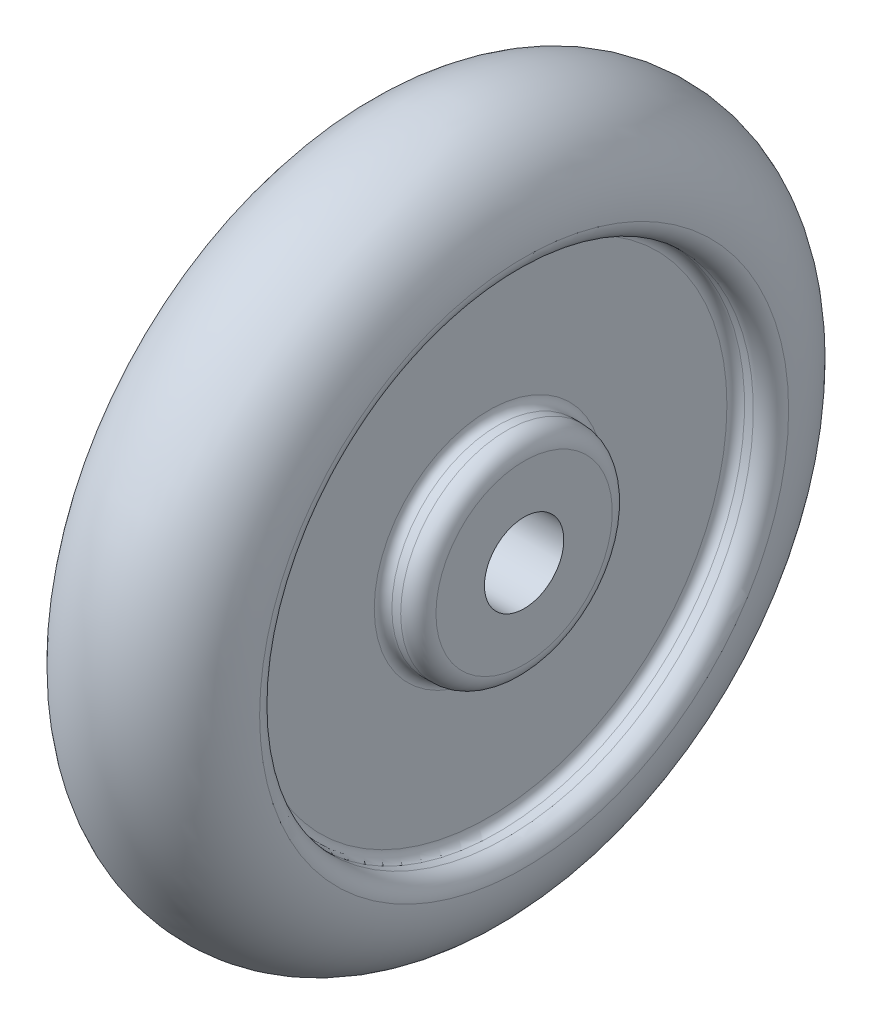
ISO-10303-21;
HEADER;
FILE_DESCRIPTION(('STEP AP214'),'2;1');
FILE_NAME('part.step','',(''),(''),'','','');
FILE_SCHEMA(('AUTOMOTIVE_DESIGN { 1 0 10303 214 1 1 1 1 }'));
ENDSEC;
DATA;
#1=APPLICATION_CONTEXT('core data for automotive mechanical design processes');
#2=APPLICATION_PROTOCOL_DEFINITION('international standard','automotive_design',2000,#1);
#3=PRODUCT_CONTEXT('',#1,'mechanical');
#4=PRODUCT('Part','Part','',(#3));
#5=PRODUCT_RELATED_PRODUCT_CATEGORY('part','',(#4));
#6=PRODUCT_DEFINITION_FORMATION('','',#4);
#7=PRODUCT_DEFINITION_CONTEXT('part definition',#1,'design');
#8=PRODUCT_DEFINITION('design','',#6,#7);
#9=PRODUCT_DEFINITION_SHAPE('','',#8);
#10=(LENGTH_UNIT() NAMED_UNIT(*) SI_UNIT(.MILLI.,.METRE.));
#11=(NAMED_UNIT(*) PLANE_ANGLE_UNIT() SI_UNIT($,.RADIAN.));
#12=(NAMED_UNIT(*) SI_UNIT($,.STERADIAN.) SOLID_ANGLE_UNIT());
#13=UNCERTAINTY_MEASURE_WITH_UNIT(LENGTH_MEASURE(1.E-05),#10,'distance_accuracy_value','');
#14=(GEOMETRIC_REPRESENTATION_CONTEXT(3) GLOBAL_UNCERTAINTY_ASSIGNED_CONTEXT((#13)) GLOBAL_UNIT_ASSIGNED_CONTEXT((#10,
#11,#12)) REPRESENTATION_CONTEXT('',''));
#15=CARTESIAN_POINT('',(0.,0.,0.));
#16=DIRECTION('',(0.,0.,1.));
#17=DIRECTION('',(1.,0.,0.));
#18=AXIS2_PLACEMENT_3D('',#15,#16,#17);
#19=CARTESIAN_POINT('',(5.,5.,0.));
#20=DIRECTION('',(-1.,0.,0.));
#21=DIRECTION('',(0.,0.,1.));
#22=AXIS2_PLACEMENT_3D('',#19,#20,#21);
#23=PLANE('',#22);
#24=CARTESIAN_POINT('',(5.,0.,0.));
#25=DIRECTION('',(-1.,0.,0.));
#26=DIRECTION('',(0.,0.,1.));
#27=AXIS2_PLACEMENT_3D('',#24,#25,#26);
#28=CIRCLE('',#27,5.);
#29=CARTESIAN_POINT('',(5.,0.,5.));
#30=VERTEX_POINT('',#29);
#31=EDGE_CURVE('E10',#30,#30,#28,.T.);
#32=ORIENTED_EDGE('',*,*,#31,.F.);
#33=EDGE_LOOP('',(#32));
#34=FACE_BOUND('',#33,.T.);
#35=CARTESIAN_POINT('',(5.00000000000001,0.,0.));
#36=DIRECTION('',(-1.,0.,0.));
#37=DIRECTION('',(0.,0.,1.));
#38=AXIS2_PLACEMENT_3D('',#35,#36,#37);
#39=CIRCLE('',#38,2.25);
#40=CARTESIAN_POINT('',(5.00000000000001,0.,2.25));
#41=VERTEX_POINT('',#40);
#42=EDGE_CURVE('E89',#41,#41,#39,.T.);
#43=ORIENTED_EDGE('',*,*,#42,.T.);
#44=EDGE_LOOP('',(#43));
#45=FACE_BOUND('',#44,.T.);
#46=ADVANCED_FACE('F31',(#34,#45),#23,.F.);
#47=CARTESIAN_POINT('',(4.,0.,0.));
#48=DIRECTION('',(-1.,0.,0.));
#49=DIRECTION('',(0.,0.,1.));
#50=AXIS2_PLACEMENT_3D('',#47,#48,#49);
#51=TOROIDAL_SURFACE('',#50,5.,1.);
#52=CARTESIAN_POINT('',(4.,0.,0.));
#53=DIRECTION('',(-1.,0.,0.));
#54=DIRECTION('',(0.,0.,1.));
#55=AXIS2_PLACEMENT_3D('',#52,#53,#54);
#56=CIRCLE('',#55,6.);
#57=CARTESIAN_POINT('',(4.,0.,6.));
#58=VERTEX_POINT('',#57);
#59=EDGE_CURVE('E37',#58,#58,#56,.T.);
#60=ORIENTED_EDGE('',*,*,#59,.F.);
#61=EDGE_LOOP('',(#60));
#62=FACE_BOUND('',#61,.T.);
#63=ORIENTED_EDGE('',*,*,#31,.T.);
#64=EDGE_LOOP('',(#63));
#65=FACE_BOUND('',#64,.T.);
#66=ADVANCED_FACE('F186',(#62,#65),#51,.T.);
#67=CARTESIAN_POINT('',(-8.92278068134318,0.,0.));
#68=DIRECTION('',(-1.,0.,0.));
#69=DIRECTION('',(0.,0.,1.));
#70=AXIS2_PLACEMENT_3D('',#67,#68,#69);
#71=CYLINDRICAL_SURFACE('',#70,6.);
#72=CARTESIAN_POINT('',(3.5,0.,0.));
#73=DIRECTION('',(-1.,0.,0.));
#74=DIRECTION('',(0.,0.,1.));
#75=AXIS2_PLACEMENT_3D('',#72,#73,#74);
#76=CIRCLE('',#75,6.);
#77=CARTESIAN_POINT('',(3.5,0.,6.));
#78=VERTEX_POINT('',#77);
#79=EDGE_CURVE('E41',#78,#78,#76,.T.);
#80=ORIENTED_EDGE('',*,*,#79,.F.);
#81=EDGE_LOOP('',(#80));
#82=FACE_BOUND('',#81,.T.);
#83=ORIENTED_EDGE('',*,*,#59,.T.);
#84=EDGE_LOOP('',(#83));
#85=FACE_BOUND('',#84,.T.);
#86=ADVANCED_FACE('F181',(#82,#85),#71,.T.);
#87=CARTESIAN_POINT('',(3.5,0.,0.));
#88=DIRECTION('',(-1.,0.,0.));
#89=DIRECTION('',(0.,0.,1.));
#90=AXIS2_PLACEMENT_3D('',#87,#88,#89);
#91=TOROIDAL_SURFACE('',#90,6.5,0.5);
#92=CARTESIAN_POINT('',(3.,0.,0.));
#93=DIRECTION('',(-1.,0.,0.));
#94=DIRECTION('',(0.,0.,1.));
#95=AXIS2_PLACEMENT_3D('',#92,#93,#94);
#96=CIRCLE('',#95,6.5);
#97=CARTESIAN_POINT('',(3.,0.,6.5));
#98=VERTEX_POINT('',#97);
#99=EDGE_CURVE('E45',#98,#98,#96,.T.);
#100=ORIENTED_EDGE('',*,*,#99,.F.);
#101=EDGE_LOOP('',(#100));
#102=FACE_BOUND('',#101,.T.);
#103=ORIENTED_EDGE('',*,*,#79,.T.);
#104=EDGE_LOOP('',(#103));
#105=FACE_BOUND('',#104,.T.);
#106=ADVANCED_FACE('F175',(#102,#105),#91,.F.);
#107=CARTESIAN_POINT('',(3.,13.5,0.));
#108=DIRECTION('',(-1.,0.,0.));
#109=DIRECTION('',(0.,0.,1.));
#110=AXIS2_PLACEMENT_3D('',#107,#108,#109);
#111=PLANE('',#110);
#112=CARTESIAN_POINT('',(3.,0.,0.));
#113=DIRECTION('',(-1.,0.,0.));
#114=DIRECTION('',(0.,0.,1.));
#115=AXIS2_PLACEMENT_3D('',#112,#113,#114);
#116=CIRCLE('',#115,13.5);
#117=CARTESIAN_POINT('',(3.,0.,13.5));
#118=VERTEX_POINT('',#117);
#119=EDGE_CURVE('E50',#118,#118,#116,.T.);
#120=ORIENTED_EDGE('',*,*,#119,.F.);
#121=EDGE_LOOP('',(#120));
#122=FACE_BOUND('',#121,.T.);
#123=ORIENTED_EDGE('',*,*,#99,.T.);
#124=EDGE_LOOP('',(#123));
#125=FACE_BOUND('',#124,.T.);
#126=ADVANCED_FACE('F169',(#122,#125),#111,.F.);
#127=CARTESIAN_POINT('',(3.5,0.,0.));
#128=DIRECTION('',(-1.,0.,0.));
#129=DIRECTION('',(0.,0.,1.));
#130=AXIS2_PLACEMENT_3D('',#127,#128,#129);
#131=TOROIDAL_SURFACE('',#130,13.5,0.5);
#132=CARTESIAN_POINT('',(3.5,0.,0.));
#133=DIRECTION('',(-1.,0.,0.));
#134=DIRECTION('',(0.,0.,1.));
#135=AXIS2_PLACEMENT_3D('',#132,#133,#134);
#136=CIRCLE('',#135,14.);
#137=CARTESIAN_POINT('',(3.5,0.,14.));
#138=VERTEX_POINT('',#137);
#139=EDGE_CURVE('E53',#138,#138,#136,.T.);
#140=ORIENTED_EDGE('',*,*,#139,.F.);
#141=EDGE_LOOP('',(#140));
#142=FACE_BOUND('',#141,.T.);
#143=ORIENTED_EDGE('',*,*,#119,.T.);
#144=EDGE_LOOP('',(#143));
#145=FACE_BOUND('',#144,.T.);
#146=ADVANCED_FACE('F163',(#142,#145),#131,.F.);
#147=CARTESIAN_POINT('',(-8.92278068134318,0.,0.));
#148=DIRECTION('',(-1.,0.,0.));
#149=DIRECTION('',(0.,0.,1.));
#150=AXIS2_PLACEMENT_3D('',#147,#148,#149);
#151=CYLINDRICAL_SURFACE('',#150,14.);
#152=CARTESIAN_POINT('',(4.,0.,0.));
#153=DIRECTION('',(-1.,0.,0.));
#154=DIRECTION('',(0.,0.,1.));
#155=AXIS2_PLACEMENT_3D('',#152,#153,#154);
#156=CIRCLE('',#155,14.);
#157=CARTESIAN_POINT('',(4.,0.,14.));
#158=VERTEX_POINT('',#157);
#159=EDGE_CURVE('E56',#158,#158,#156,.T.);
#160=ORIENTED_EDGE('',*,*,#159,.F.);
#161=EDGE_LOOP('',(#160));
#162=FACE_BOUND('',#161,.T.);
#163=ORIENTED_EDGE('',*,*,#139,.T.);
#164=EDGE_LOOP('',(#163));
#165=FACE_BOUND('',#164,.T.);
#166=ADVANCED_FACE('F157',(#162,#165),#151,.F.);
#167=CARTESIAN_POINT('',(4.,0.,0.));
#168=DIRECTION('',(-1.,0.,0.));
#169=DIRECTION('',(0.,0.,1.));
#170=AXIS2_PLACEMENT_3D('',#167,#168,#169);
#171=TOROIDAL_SURFACE('',#170,15.,1.);
#172=CARTESIAN_POINT('',(5.,0.,0.));
#173=DIRECTION('',(-1.,0.,0.));
#174=DIRECTION('',(0.,0.,1.));
#175=AXIS2_PLACEMENT_3D('',#172,#173,#174);
#176=CIRCLE('',#175,15.);
#177=CARTESIAN_POINT('',(5.,0.,15.));
#178=VERTEX_POINT('',#177);
#179=EDGE_CURVE('E59',#178,#178,#176,.T.);
#180=ORIENTED_EDGE('',*,*,#179,.F.);
#181=EDGE_LOOP('',(#180));
#182=FACE_BOUND('',#181,.T.);
#183=ORIENTED_EDGE('',*,*,#159,.T.);
#184=EDGE_LOOP('',(#183));
#185=FACE_BOUND('',#184,.T.);
#186=ADVANCED_FACE('F151',(#182,#185),#171,.T.);
#187=CARTESIAN_POINT('',(0.,0.,0.));
#188=DIRECTION('',(-1.,0.,0.));
#189=DIRECTION('',(0.,0.,1.));
#190=AXIS2_PLACEMENT_3D('',#187,#188,#189);
#191=TOROIDAL_SURFACE('',#190,15.,5.);
#192=CARTESIAN_POINT('',(-5.,0.,0.));
#193=DIRECTION('',(-1.,0.,0.));
#194=DIRECTION('',(0.,0.,1.));
#195=AXIS2_PLACEMENT_3D('',#192,#193,#194);
#196=CIRCLE('',#195,15.);
#197=CARTESIAN_POINT('',(-5.,0.,15.));
#198=VERTEX_POINT('',#197);
#199=EDGE_CURVE('E62',#198,#198,#196,.T.);
#200=ORIENTED_EDGE('',*,*,#199,.F.);
#201=EDGE_LOOP('',(#200));
#202=FACE_BOUND('',#201,.T.);
#203=ORIENTED_EDGE('',*,*,#179,.T.);
#204=EDGE_LOOP('',(#203));
#205=FACE_BOUND('',#204,.T.);
#206=ADVANCED_FACE('F145',(#202,#205),#191,.T.);
#207=CARTESIAN_POINT('',(-4.,0.,0.));
#208=DIRECTION('',(-1.,0.,0.));
#209=DIRECTION('',(0.,0.,1.));
#210=AXIS2_PLACEMENT_3D('',#207,#208,#209);
#211=TOROIDAL_SURFACE('',#210,15.,1.);
#212=CARTESIAN_POINT('',(-4.,0.,0.));
#213=DIRECTION('',(-1.,0.,0.));
#214=DIRECTION('',(0.,0.,1.));
#215=AXIS2_PLACEMENT_3D('',#212,#213,#214);
#216=CIRCLE('',#215,14.);
#217=CARTESIAN_POINT('',(-4.,0.,14.));
#218=VERTEX_POINT('',#217);
#219=EDGE_CURVE('E65',#218,#218,#216,.T.);
#220=ORIENTED_EDGE('',*,*,#219,.F.);
#221=EDGE_LOOP('',(#220));
#222=FACE_BOUND('',#221,.T.);
#223=ORIENTED_EDGE('',*,*,#199,.T.);
#224=EDGE_LOOP('',(#223));
#225=FACE_BOUND('',#224,.T.);
#226=ADVANCED_FACE('F139',(#222,#225),#211,.T.);
#227=CARTESIAN_POINT('',(-8.92278068134318,0.,0.));
#228=DIRECTION('',(-1.,0.,0.));
#229=DIRECTION('',(0.,0.,1.));
#230=AXIS2_PLACEMENT_3D('',#227,#228,#229);
#231=CYLINDRICAL_SURFACE('',#230,14.);
#232=CARTESIAN_POINT('',(-3.5,0.,0.));
#233=DIRECTION('',(-1.,0.,0.));
#234=DIRECTION('',(0.,0.,1.));
#235=AXIS2_PLACEMENT_3D('',#232,#233,#234);
#236=CIRCLE('',#235,14.);
#237=CARTESIAN_POINT('',(-3.5,0.,14.));
#238=VERTEX_POINT('',#237);
#239=EDGE_CURVE('E68',#238,#238,#236,.T.);
#240=ORIENTED_EDGE('',*,*,#239,.F.);
#241=EDGE_LOOP('',(#240));
#242=FACE_BOUND('',#241,.T.);
#243=ORIENTED_EDGE('',*,*,#219,.T.);
#244=EDGE_LOOP('',(#243));
#245=FACE_BOUND('',#244,.T.);
#246=ADVANCED_FACE('F133',(#242,#245),#231,.F.);
#247=CARTESIAN_POINT('',(-3.5,0.,0.));
#248=DIRECTION('',(-1.,0.,0.));
#249=DIRECTION('',(0.,0.,1.));
#250=AXIS2_PLACEMENT_3D('',#247,#248,#249);
#251=TOROIDAL_SURFACE('',#250,13.5,0.5);
#252=CARTESIAN_POINT('',(-3.,0.,0.));
#253=DIRECTION('',(-1.,0.,0.));
#254=DIRECTION('',(0.,0.,1.));
#255=AXIS2_PLACEMENT_3D('',#252,#253,#254);
#256=CIRCLE('',#255,13.5);
#257=CARTESIAN_POINT('',(-3.,0.,13.5));
#258=VERTEX_POINT('',#257);
#259=EDGE_CURVE('E71',#258,#258,#256,.T.);
#260=ORIENTED_EDGE('',*,*,#259,.F.);
#261=EDGE_LOOP('',(#260));
#262=FACE_BOUND('',#261,.T.);
#263=ORIENTED_EDGE('',*,*,#239,.T.);
#264=EDGE_LOOP('',(#263));
#265=FACE_BOUND('',#264,.T.);
#266=ADVANCED_FACE('F127',(#262,#265),#251,.F.);
#267=CARTESIAN_POINT('',(-3.,13.5,0.));
#268=DIRECTION('',(1.,0.,0.));
#269=DIRECTION('',(0.,0.,-1.));
#270=AXIS2_PLACEMENT_3D('',#267,#268,#269);
#271=PLANE('',#270);
#272=CARTESIAN_POINT('',(-3.,0.,0.));
#273=DIRECTION('',(-1.,0.,0.));
#274=DIRECTION('',(0.,0.,1.));
#275=AXIS2_PLACEMENT_3D('',#272,#273,#274);
#276=CIRCLE('',#275,6.5);
#277=CARTESIAN_POINT('',(-3.,0.,6.5));
#278=VERTEX_POINT('',#277);
#279=EDGE_CURVE('E74',#278,#278,#276,.T.);
#280=ORIENTED_EDGE('',*,*,#279,.F.);
#281=EDGE_LOOP('',(#280));
#282=FACE_BOUND('',#281,.T.);
#283=ORIENTED_EDGE('',*,*,#259,.T.);
#284=EDGE_LOOP('',(#283));
#285=FACE_BOUND('',#284,.T.);
#286=ADVANCED_FACE('F121',(#282,#285),#271,.F.);
#287=CARTESIAN_POINT('',(-3.5,0.,0.));
#288=DIRECTION('',(-1.,0.,0.));
#289=DIRECTION('',(0.,0.,1.));
#290=AXIS2_PLACEMENT_3D('',#287,#288,#289);
#291=TOROIDAL_SURFACE('',#290,6.5,0.5);
#292=CARTESIAN_POINT('',(-3.5,0.,0.));
#293=DIRECTION('',(-1.,0.,0.));
#294=DIRECTION('',(0.,0.,1.));
#295=AXIS2_PLACEMENT_3D('',#292,#293,#294);
#296=CIRCLE('',#295,6.);
#297=CARTESIAN_POINT('',(-3.5,0.,6.));
#298=VERTEX_POINT('',#297);
#299=EDGE_CURVE('E77',#298,#298,#296,.T.);
#300=ORIENTED_EDGE('',*,*,#299,.F.);
#301=EDGE_LOOP('',(#300));
#302=FACE_BOUND('',#301,.T.);
#303=ORIENTED_EDGE('',*,*,#279,.T.);
#304=EDGE_LOOP('',(#303));
#305=FACE_BOUND('',#304,.T.);
#306=ADVANCED_FACE('F115',(#302,#305),#291,.F.);
#307=CARTESIAN_POINT('',(-8.92278068134318,0.,0.));
#308=DIRECTION('',(-1.,0.,0.));
#309=DIRECTION('',(0.,0.,1.));
#310=AXIS2_PLACEMENT_3D('',#307,#308,#309);
#311=CYLINDRICAL_SURFACE('',#310,6.);
#312=CARTESIAN_POINT('',(-4.,0.,0.));
#313=DIRECTION('',(-1.,0.,0.));
#314=DIRECTION('',(0.,0.,1.));
#315=AXIS2_PLACEMENT_3D('',#312,#313,#314);
#316=CIRCLE('',#315,6.);
#317=CARTESIAN_POINT('',(-4.,0.,6.));
#318=VERTEX_POINT('',#317);
#319=EDGE_CURVE('E80',#318,#318,#316,.T.);
#320=ORIENTED_EDGE('',*,*,#319,.F.);
#321=EDGE_LOOP('',(#320));
#322=FACE_BOUND('',#321,.T.);
#323=ORIENTED_EDGE('',*,*,#299,.T.);
#324=EDGE_LOOP('',(#323));
#325=FACE_BOUND('',#324,.T.);
#326=ADVANCED_FACE('F109',(#322,#325),#311,.T.);
#327=CARTESIAN_POINT('',(-4.,0.,0.));
#328=DIRECTION('',(-1.,0.,0.));
#329=DIRECTION('',(0.,0.,1.));
#330=AXIS2_PLACEMENT_3D('',#327,#328,#329);
#331=TOROIDAL_SURFACE('',#330,5.,1.);
#332=CARTESIAN_POINT('',(-5.,0.,0.));
#333=DIRECTION('',(-1.,0.,0.));
#334=DIRECTION('',(0.,0.,1.));
#335=AXIS2_PLACEMENT_3D('',#332,#333,#334);
#336=CIRCLE('',#335,5.);
#337=CARTESIAN_POINT('',(-5.,0.,5.));
#338=VERTEX_POINT('',#337);
#339=EDGE_CURVE('E83',#338,#338,#336,.T.);
#340=ORIENTED_EDGE('',*,*,#339,.F.);
#341=EDGE_LOOP('',(#340));
#342=FACE_BOUND('',#341,.T.);
#343=ORIENTED_EDGE('',*,*,#319,.T.);
#344=EDGE_LOOP('',(#343));
#345=FACE_BOUND('',#344,.T.);
#346=ADVANCED_FACE('F103',(#342,#345),#331,.T.);
#347=CARTESIAN_POINT('',(-5.,5.,0.));
#348=DIRECTION('',(1.,0.,0.));
#349=DIRECTION('',(0.,0.,-1.));
#350=AXIS2_PLACEMENT_3D('',#347,#348,#349);
#351=PLANE('',#350);
#352=CARTESIAN_POINT('',(-5.,0.,0.));
#353=DIRECTION('',(-1.,0.,0.));
#354=DIRECTION('',(0.,0.,1.));
#355=AXIS2_PLACEMENT_3D('',#352,#353,#354);
#356=CIRCLE('',#355,2.25);
#357=CARTESIAN_POINT('',(-5.,0.,2.25));
#358=VERTEX_POINT('',#357);
#359=EDGE_CURVE('E86',#358,#358,#356,.T.);
#360=ORIENTED_EDGE('',*,*,#359,.F.);
#361=EDGE_LOOP('',(#360));
#362=FACE_BOUND('',#361,.T.);
#363=ORIENTED_EDGE('',*,*,#339,.T.);
#364=EDGE_LOOP('',(#363));
#365=FACE_BOUND('',#364,.T.);
#366=ADVANCED_FACE('F97',(#362,#365),#351,.F.);
#367=CARTESIAN_POINT('',(-8.92278068134318,0.,0.));
#368=DIRECTION('',(-1.,0.,0.));
#369=DIRECTION('',(0.,0.,1.));
#370=AXIS2_PLACEMENT_3D('',#367,#368,#369);
#371=CYLINDRICAL_SURFACE('',#370,2.25);
#372=ORIENTED_EDGE('',*,*,#42,.F.);
#373=EDGE_LOOP('',(#372));
#374=FACE_BOUND('',#373,.T.);
#375=ORIENTED_EDGE('',*,*,#359,.T.);
#376=EDGE_LOOP('',(#375));
#377=FACE_BOUND('',#376,.T.);
#378=ADVANCED_FACE('F94',(#374,#377),#371,.F.);
#379=CLOSED_SHELL('',(#46,#66,#86,#106,#126,#146,#166,#186,#206,#226,#246,#266,#286,#306,#326,
#346,#366,#378));
#380=MANIFOLD_SOLID_BREP('B2',#379);
#381=ADVANCED_BREP_SHAPE_REPRESENTATION('',(#18,#380),#14);
#382=SHAPE_DEFINITION_REPRESENTATION(#9,#381);
ENDSEC;
END-ISO-10303-21;
